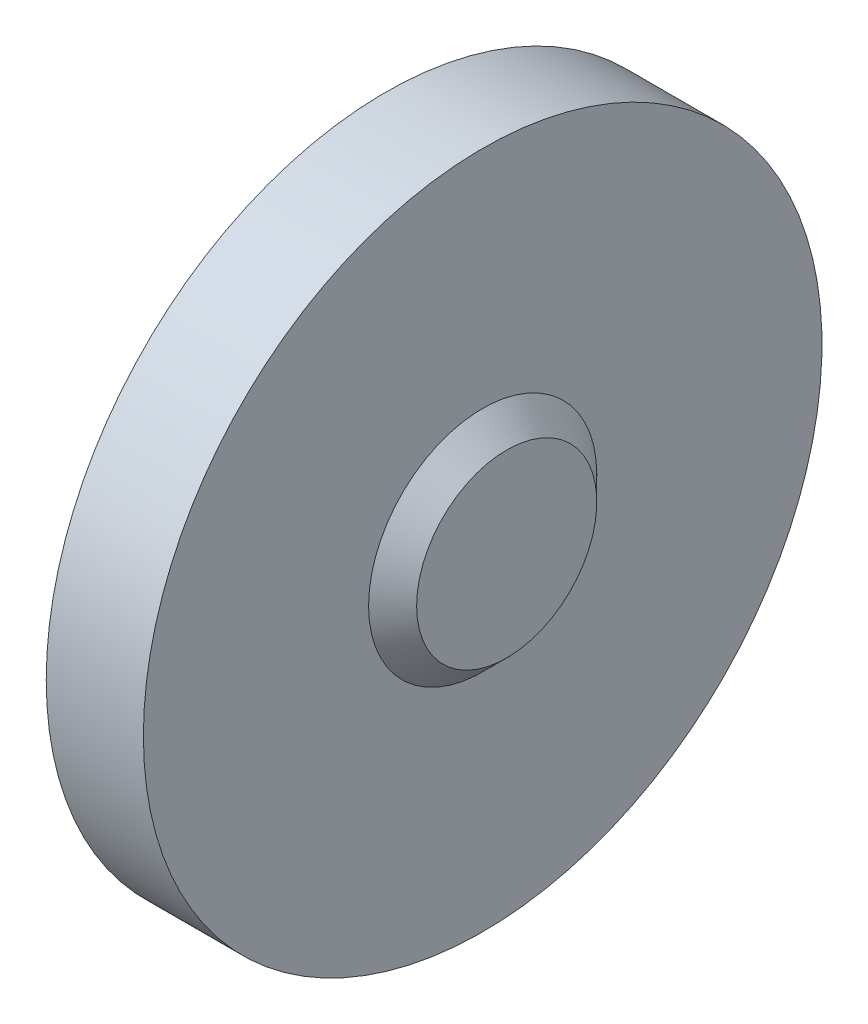
ISO-10303-21;
HEADER;
FILE_DESCRIPTION(('STEP AP214'),'2;1');
FILE_NAME('part.step','',(''),(''),'','','');
FILE_SCHEMA(('AUTOMOTIVE_DESIGN { 1 0 10303 214 1 1 1 1 }'));
ENDSEC;
DATA;
#1=APPLICATION_CONTEXT('core data for automotive mechanical design processes');
#2=APPLICATION_PROTOCOL_DEFINITION('international standard','automotive_design',2000,#1);
#3=PRODUCT_CONTEXT('',#1,'mechanical');
#4=PRODUCT('Part','Part','',(#3));
#5=PRODUCT_RELATED_PRODUCT_CATEGORY('part','',(#4));
#6=PRODUCT_DEFINITION_FORMATION('','',#4);
#7=PRODUCT_DEFINITION_CONTEXT('part definition',#1,'design');
#8=PRODUCT_DEFINITION('design','',#6,#7);
#9=PRODUCT_DEFINITION_SHAPE('','',#8);
#10=(LENGTH_UNIT() NAMED_UNIT(*) SI_UNIT(.MILLI.,.METRE.));
#11=(NAMED_UNIT(*) PLANE_ANGLE_UNIT() SI_UNIT($,.RADIAN.));
#12=(NAMED_UNIT(*) SI_UNIT($,.STERADIAN.) SOLID_ANGLE_UNIT());
#13=UNCERTAINTY_MEASURE_WITH_UNIT(LENGTH_MEASURE(1.E-05),#10,'distance_accuracy_value','');
#14=(GEOMETRIC_REPRESENTATION_CONTEXT(3) GLOBAL_UNCERTAINTY_ASSIGNED_CONTEXT((#13)) GLOBAL_UNIT_ASSIGNED_CONTEXT((#10,
#11,#12)) REPRESENTATION_CONTEXT('',''));
#15=CARTESIAN_POINT('',(0.,0.,0.));
#16=DIRECTION('',(0.,0.,1.));
#17=DIRECTION('',(1.,0.,0.));
#18=AXIS2_PLACEMENT_3D('',#15,#16,#17);
#19=CARTESIAN_POINT('',(-12.,0.,0.));
#20=DIRECTION('',(-1.,0.,0.));
#21=DIRECTION('',(0.,0.,1.));
#22=AXIS2_PLACEMENT_3D('',#19,#20,#21);
#23=CYLINDRICAL_SURFACE('',#22,28.);
#24=CARTESIAN_POINT('',(-10.,0.,0.));
#25=DIRECTION('',(-1.,0.,0.));
#26=DIRECTION('',(0.,0.,1.));
#27=AXIS2_PLACEMENT_3D('',#24,#25,#26);
#28=CIRCLE('',#27,28.);
#29=CARTESIAN_POINT('',(-10.,0.,28.));
#30=VERTEX_POINT('',#29);
#31=EDGE_CURVE('E10',#30,#30,#28,.T.);
#32=ORIENTED_EDGE('',*,*,#31,.F.);
#33=EDGE_LOOP('',(#32));
#34=FACE_BOUND('',#33,.T.);
#35=CARTESIAN_POINT('',(-1.98230088495579,0.,0.));
#36=DIRECTION('',(-1.,0.,0.));
#37=DIRECTION('',(0.,0.,1.));
#38=AXIS2_PLACEMENT_3D('',#35,#36,#37);
#39=CIRCLE('',#38,28.);
#40=CARTESIAN_POINT('',(-1.98230088495579,0.,28.));
#41=VERTEX_POINT('',#40);
#42=EDGE_CURVE('E59',#41,#41,#39,.T.);
#43=ORIENTED_EDGE('',*,*,#42,.T.);
#44=EDGE_LOOP('',(#43));
#45=FACE_BOUND('',#44,.T.);
#46=ADVANCED_FACE('F31',(#34,#45),#23,.T.);
#47=CARTESIAN_POINT('',(-10.,28.,0.));
#48=DIRECTION('',(1.,0.,0.));
#49=DIRECTION('',(0.,0.,-1.));
#50=AXIS2_PLACEMENT_3D('',#47,#48,#49);
#51=PLANE('',#50);
#52=CARTESIAN_POINT('',(-10.,0.,0.));
#53=DIRECTION('',(-1.,0.,0.));
#54=DIRECTION('',(0.,0.,1.));
#55=AXIS2_PLACEMENT_3D('',#52,#53,#54);
#56=CIRCLE('',#55,21.3097345132743);
#57=CARTESIAN_POINT('',(-10.,0.,21.3097345132743));
#58=VERTEX_POINT('',#57);
#59=EDGE_CURVE('E37',#58,#58,#56,.T.);
#60=ORIENTED_EDGE('',*,*,#59,.F.);
#61=EDGE_LOOP('',(#60));
#62=FACE_BOUND('',#61,.T.);
#63=ORIENTED_EDGE('',*,*,#31,.T.);
#64=EDGE_LOOP('',(#63));
#65=FACE_BOUND('',#64,.T.);
#66=ADVANCED_FACE('F87',(#62,#65),#51,.F.);
#67=CARTESIAN_POINT('',(-12.,0.,0.));
#68=DIRECTION('',(-1.,0.,0.));
#69=DIRECTION('',(0.,0.,1.));
#70=AXIS2_PLACEMENT_3D('',#67,#68,#69);
#71=CYLINDRICAL_SURFACE('',#70,21.3097345132743);
#72=CARTESIAN_POINT('',(-5.,0.,0.));
#73=DIRECTION('',(-1.,0.,0.));
#74=DIRECTION('',(0.,0.,1.));
#75=AXIS2_PLACEMENT_3D('',#72,#73,#74);
#76=CIRCLE('',#75,21.3097345132743);
#77=CARTESIAN_POINT('',(-5.,0.,21.3097345132743));
#78=VERTEX_POINT('',#77);
#79=EDGE_CURVE('E41',#78,#78,#76,.T.);
#80=ORIENTED_EDGE('',*,*,#79,.F.);
#81=EDGE_LOOP('',(#80));
#82=FACE_BOUND('',#81,.T.);
#83=ORIENTED_EDGE('',*,*,#59,.T.);
#84=EDGE_LOOP('',(#83));
#85=FACE_BOUND('',#84,.T.);
#86=ADVANCED_FACE('F92',(#82,#85),#71,.F.);
#87=CARTESIAN_POINT('',(-5.,21.3097345132743,0.));
#88=DIRECTION('',(1.,0.,0.));
#89=DIRECTION('',(0.,0.,-1.));
#90=AXIS2_PLACEMENT_3D('',#87,#88,#89);
#91=PLANE('',#90);
#92=CARTESIAN_POINT('',(-5.,0.,0.));
#93=DIRECTION('',(-1.,0.,0.));
#94=DIRECTION('',(0.,0.,1.));
#95=AXIS2_PLACEMENT_3D('',#92,#93,#94);
#96=CIRCLE('',#95,7.43362831858407);
#97=CARTESIAN_POINT('',(-5.,0.,7.43362831858407));
#98=VERTEX_POINT('',#97);
#99=EDGE_CURVE('E45',#98,#98,#96,.T.);
#100=ORIENTED_EDGE('',*,*,#99,.F.);
#101=EDGE_LOOP('',(#100));
#102=FACE_BOUND('',#101,.T.);
#103=ORIENTED_EDGE('',*,*,#79,.T.);
#104=EDGE_LOOP('',(#103));
#105=FACE_BOUND('',#104,.T.);
#106=ADVANCED_FACE('F97',(#102,#105),#91,.F.);
#107=CARTESIAN_POINT('',(-12.,0.,0.));
#108=DIRECTION('',(-1.,0.,0.));
#109=DIRECTION('',(0.,0.,1.));
#110=AXIS2_PLACEMENT_3D('',#107,#108,#109);
#111=CYLINDRICAL_SURFACE('',#110,7.43362831858407);
#112=CARTESIAN_POINT('',(-12.,0.,0.));
#113=DIRECTION('',(-1.,0.,0.));
#114=DIRECTION('',(0.,0.,1.));
#115=AXIS2_PLACEMENT_3D('',#112,#113,#114);
#116=CIRCLE('',#115,7.43362831858407);
#117=CARTESIAN_POINT('',(-12.,0.,7.43362831858407));
#118=VERTEX_POINT('',#117);
#119=EDGE_CURVE('E50',#118,#118,#116,.T.);
#120=ORIENTED_EDGE('',*,*,#119,.F.);
#121=EDGE_LOOP('',(#120));
#122=FACE_BOUND('',#121,.T.);
#123=ORIENTED_EDGE('',*,*,#99,.T.);
#124=EDGE_LOOP('',(#123));
#125=FACE_BOUND('',#124,.T.);
#126=ADVANCED_FACE('F83',(#122,#125),#111,.T.);
#127=CARTESIAN_POINT('',(-12.,7.43362831858407,0.));
#128=DIRECTION('',(1.,0.,0.));
#129=DIRECTION('',(0.,0.,-1.));
#130=AXIS2_PLACEMENT_3D('',#127,#128,#129);
#131=PLANE('',#130);
#132=ORIENTED_EDGE('',*,*,#119,.T.);
#133=EDGE_LOOP('',(#132));
#134=FACE_BOUND('',#133,.T.);
#135=ADVANCED_FACE('F78',(#134),#131,.F.);
#136=CARTESIAN_POINT('',(0.,7.43362831858407,0.));
#137=DIRECTION('',(-1.,0.,0.));
#138=DIRECTION('',(0.,0.,1.));
#139=AXIS2_PLACEMENT_3D('',#136,#137,#138);
#140=PLANE('',#139);
#141=CARTESIAN_POINT('',(0.,0.,0.));
#142=DIRECTION('',(-1.,0.,0.));
#143=DIRECTION('',(0.,0.,1.));
#144=AXIS2_PLACEMENT_3D('',#141,#142,#143);
#145=CIRCLE('',#144,7.43362831858407);
#146=CARTESIAN_POINT('',(0.,0.,7.43362831858407));
#147=VERTEX_POINT('',#146);
#148=EDGE_CURVE('E53',#147,#147,#145,.T.);
#149=ORIENTED_EDGE('',*,*,#148,.F.);
#150=EDGE_LOOP('',(#149));
#151=FACE_BOUND('',#150,.T.);
#152=ADVANCED_FACE('F73',(#151),#140,.F.);
#153=CARTESIAN_POINT('',(0.,0.,0.));
#154=DIRECTION('',(-1.,0.,0.));
#155=DIRECTION('',(0.,0.,1.));
#156=AXIS2_PLACEMENT_3D('',#153,#154,#155);
#157=CONICAL_SURFACE('',#156,7.43362831858407,0.785398163397448);
#158=CARTESIAN_POINT('',(-1.98230088495579,0.,0.));
#159=DIRECTION('',(-1.,0.,0.));
#160=DIRECTION('',(0.,0.,1.));
#161=AXIS2_PLACEMENT_3D('',#158,#159,#160);
#162=CIRCLE('',#161,9.41592920353985);
#163=CARTESIAN_POINT('',(-1.98230088495579,0.,9.41592920353985));
#164=VERTEX_POINT('',#163);
#165=EDGE_CURVE('E56',#164,#164,#162,.T.);
#166=ORIENTED_EDGE('',*,*,#165,.F.);
#167=EDGE_LOOP('',(#166));
#168=FACE_BOUND('',#167,.T.);
#169=ORIENTED_EDGE('',*,*,#148,.T.);
#170=EDGE_LOOP('',(#169));
#171=FACE_BOUND('',#170,.T.);
#172=ADVANCED_FACE('F67',(#168,#171),#157,.T.);
#173=CARTESIAN_POINT('',(-1.98230088495578,9.41592920353985,0.));
#174=DIRECTION('',(-1.,0.,0.));
#175=DIRECTION('',(0.,0.,1.));
#176=AXIS2_PLACEMENT_3D('',#173,#174,#175);
#177=PLANE('',#176);
#178=ORIENTED_EDGE('',*,*,#42,.F.);
#179=EDGE_LOOP('',(#178));
#180=FACE_BOUND('',#179,.T.);
#181=ORIENTED_EDGE('',*,*,#165,.T.);
#182=EDGE_LOOP('',(#181));
#183=FACE_BOUND('',#182,.T.);
#184=ADVANCED_FACE('F64',(#180,#183),#177,.F.);
#185=CLOSED_SHELL('',(#46,#66,#86,#106,#126,#135,#152,#172,#184));
#186=MANIFOLD_SOLID_BREP('B2',#185);
#187=ADVANCED_BREP_SHAPE_REPRESENTATION('',(#18,#186),#14);
#188=SHAPE_DEFINITION_REPRESENTATION(#9,#187);
ENDSEC;
END-ISO-10303-21;
